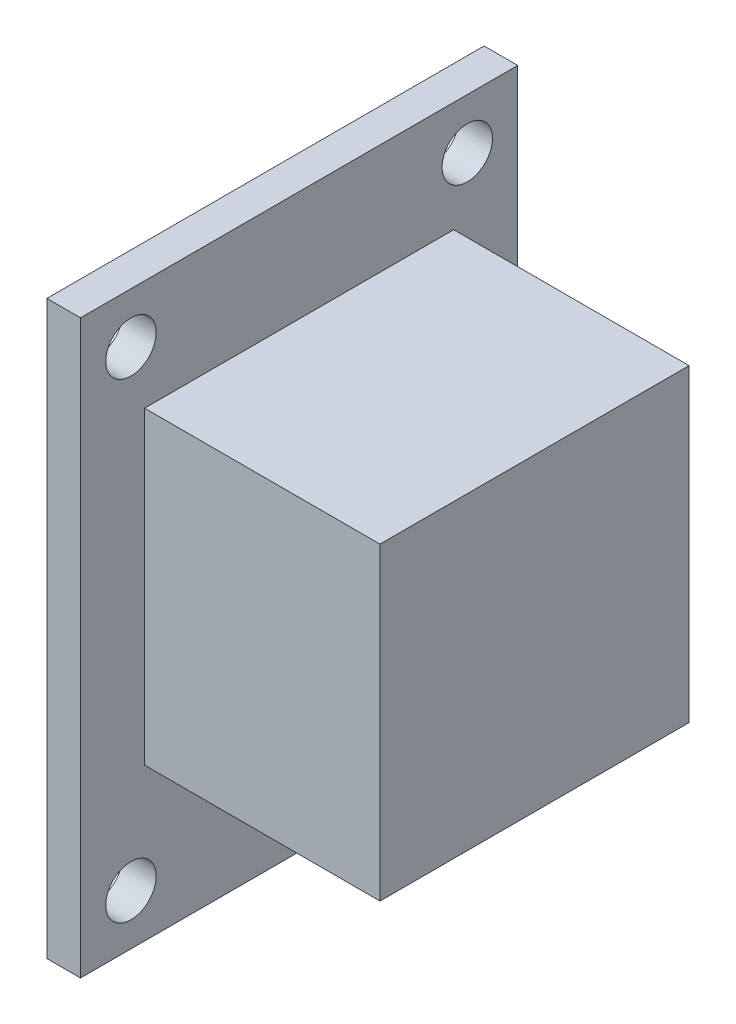
ISO-10303-21;
HEADER;
FILE_DESCRIPTION(('STEP AP214'),'2;1');
FILE_NAME('part.step','',(''),(''),'','','');
FILE_SCHEMA(('AUTOMOTIVE_DESIGN { 1 0 10303 214 1 1 1 1 }'));
ENDSEC;
DATA;
#1=APPLICATION_CONTEXT('core data for automotive mechanical design processes');
#2=APPLICATION_PROTOCOL_DEFINITION('international standard','automotive_design',2000,#1);
#3=PRODUCT_CONTEXT('',#1,'mechanical');
#4=PRODUCT('Part','Part','',(#3));
#5=PRODUCT_RELATED_PRODUCT_CATEGORY('part','',(#4));
#6=PRODUCT_DEFINITION_FORMATION('','',#4);
#7=PRODUCT_DEFINITION_CONTEXT('part definition',#1,'design');
#8=PRODUCT_DEFINITION('design','',#6,#7);
#9=PRODUCT_DEFINITION_SHAPE('','',#8);
#10=(LENGTH_UNIT() NAMED_UNIT(*) SI_UNIT(.MILLI.,.METRE.));
#11=(NAMED_UNIT(*) PLANE_ANGLE_UNIT() SI_UNIT($,.RADIAN.));
#12=(NAMED_UNIT(*) SI_UNIT($,.STERADIAN.) SOLID_ANGLE_UNIT());
#13=UNCERTAINTY_MEASURE_WITH_UNIT(LENGTH_MEASURE(1.E-05),#10,'distance_accuracy_value','');
#14=(GEOMETRIC_REPRESENTATION_CONTEXT(3) GLOBAL_UNCERTAINTY_ASSIGNED_CONTEXT((#13)) GLOBAL_UNIT_ASSIGNED_CONTEXT((#10,
#11,#12)) REPRESENTATION_CONTEXT('',''));
#15=CARTESIAN_POINT('',(0.,0.,0.));
#16=DIRECTION('',(0.,0.,1.));
#17=DIRECTION('',(1.,0.,0.));
#18=AXIS2_PLACEMENT_3D('',#15,#16,#17);
#19=CARTESIAN_POINT('',(14.,-7.94238815542512,-9.19238815542511));
#20=DIRECTION('',(0.,0.,1.));
#21=DIRECTION('',(1.,0.,0.));
#22=AXIS2_PLACEMENT_3D('',#19,#20,#21);
#23=PLANE('',#22);
#24=DIRECTION('',(0.,1.,0.));
#25=VECTOR('',#24,1.);
#26=CARTESIAN_POINT('',(0.,-7.94238815542512,-9.19238815542511));
#27=LINE('',#26,#25);
#28=CARTESIAN_POINT('',(0.,-7.94238815542512,-9.19238815542511));
#29=VERTEX_POINT('',#28);
#30=CARTESIAN_POINT('',(0.,10.4423881554251,-9.19238815542511));
#31=VERTEX_POINT('',#30);
#32=EDGE_CURVE('E128',#29,#31,#27,.T.);
#33=ORIENTED_EDGE('',*,*,#32,.T.);
#34=DIRECTION('',(-1.,0.,0.));
#35=VECTOR('',#34,1.);
#36=CARTESIAN_POINT('',(14.,10.4423881554251,-9.19238815542511));
#37=LINE('',#36,#35);
#38=CARTESIAN_POINT('',(14.,10.4423881554251,-9.19238815542511));
#39=VERTEX_POINT('',#38);
#40=EDGE_CURVE('E11',#39,#31,#37,.T.);
#41=ORIENTED_EDGE('',*,*,#40,.F.);
#42=DIRECTION('',(0.,1.,0.));
#43=VECTOR('',#42,1.);
#44=CARTESIAN_POINT('',(14.,-7.94238815542512,-9.19238815542511));
#45=LINE('',#44,#43);
#46=CARTESIAN_POINT('',(14.,-7.94238815542512,-9.19238815542511));
#47=VERTEX_POINT('',#46);
#48=EDGE_CURVE('E137',#47,#39,#45,.T.);
#49=ORIENTED_EDGE('',*,*,#48,.F.);
#50=DIRECTION('',(-1.,0.,0.));
#51=VECTOR('',#50,1.);
#52=CARTESIAN_POINT('',(14.,-7.94238815542512,-9.19238815542511));
#53=LINE('',#52,#51);
#54=EDGE_CURVE('E144',#47,#29,#53,.T.);
#55=ORIENTED_EDGE('',*,*,#54,.T.);
#56=EDGE_LOOP('',(#33,#41,#49,#55));
#57=FACE_BOUND('',#56,.T.);
#58=ADVANCED_FACE('F43',(#57),#23,.F.);
#59=CARTESIAN_POINT('',(14.,10.4423881554251,9.19238815542512));
#60=DIRECTION('',(0.,-1.,0.));
#61=DIRECTION('',(0.,0.,-1.));
#62=AXIS2_PLACEMENT_3D('',#59,#60,#61);
#63=PLANE('',#62);
#64=DIRECTION('',(0.,0.,1.));
#65=VECTOR('',#64,1.);
#66=CARTESIAN_POINT('',(0.,10.4423881554251,9.19238815542512));
#67=LINE('',#66,#65);
#68=CARTESIAN_POINT('',(0.,10.4423881554251,9.19238815542512));
#69=VERTEX_POINT('',#68);
#70=EDGE_CURVE('E131',#31,#69,#67,.T.);
#71=ORIENTED_EDGE('',*,*,#70,.T.);
#72=DIRECTION('',(-1.,0.,0.));
#73=VECTOR('',#72,1.);
#74=CARTESIAN_POINT('',(14.,10.4423881554251,9.19238815542512));
#75=LINE('',#74,#73);
#76=CARTESIAN_POINT('',(14.,10.4423881554251,9.19238815542512));
#77=VERTEX_POINT('',#76);
#78=EDGE_CURVE('E51',#77,#69,#75,.T.);
#79=ORIENTED_EDGE('',*,*,#78,.F.);
#80=DIRECTION('',(0.,0.,1.));
#81=VECTOR('',#80,1.);
#82=CARTESIAN_POINT('',(14.,10.4423881554251,9.19238815542512));
#83=LINE('',#82,#81);
#84=EDGE_CURVE('E139',#39,#77,#83,.T.);
#85=ORIENTED_EDGE('',*,*,#84,.F.);
#86=ORIENTED_EDGE('',*,*,#40,.T.);
#87=EDGE_LOOP('',(#71,#79,#85,#86));
#88=FACE_BOUND('',#87,.T.);
#89=ADVANCED_FACE('F165',(#88),#63,.F.);
#90=CARTESIAN_POINT('',(14.,-7.94238815542512,9.19238815542512));
#91=DIRECTION('',(0.,0.,-1.));
#92=DIRECTION('',(-1.,0.,0.));
#93=AXIS2_PLACEMENT_3D('',#90,#91,#92);
#94=PLANE('',#93);
#95=DIRECTION('',(0.,-1.,0.));
#96=VECTOR('',#95,1.);
#97=CARTESIAN_POINT('',(0.,-7.94238815542512,9.19238815542512));
#98=LINE('',#97,#96);
#99=CARTESIAN_POINT('',(0.,-7.94238815542512,9.19238815542512));
#100=VERTEX_POINT('',#99);
#101=EDGE_CURVE('E148',#69,#100,#98,.T.);
#102=ORIENTED_EDGE('',*,*,#101,.T.);
#103=DIRECTION('',(-1.,0.,0.));
#104=VECTOR('',#103,1.);
#105=CARTESIAN_POINT('',(14.,-7.94238815542512,9.19238815542512));
#106=LINE('',#105,#104);
#107=CARTESIAN_POINT('',(14.,-7.94238815542512,9.19238815542512));
#108=VERTEX_POINT('',#107);
#109=EDGE_CURVE('E155',#108,#100,#106,.T.);
#110=ORIENTED_EDGE('',*,*,#109,.F.);
#111=DIRECTION('',(0.,-1.,0.));
#112=VECTOR('',#111,1.);
#113=CARTESIAN_POINT('',(14.,-7.94238815542512,9.19238815542512));
#114=LINE('',#113,#112);
#115=EDGE_CURVE('E142',#77,#108,#114,.T.);
#116=ORIENTED_EDGE('',*,*,#115,.F.);
#117=ORIENTED_EDGE('',*,*,#78,.T.);
#118=EDGE_LOOP('',(#102,#110,#116,#117));
#119=FACE_BOUND('',#118,.T.);
#120=ADVANCED_FACE('F161',(#119),#94,.F.);
#121=CARTESIAN_POINT('',(14.,-7.94238815542512,9.19238815542512));
#122=DIRECTION('',(0.,1.,0.));
#123=DIRECTION('',(0.,0.,1.));
#124=AXIS2_PLACEMENT_3D('',#121,#122,#123);
#125=PLANE('',#124);
#126=DIRECTION('',(0.,0.,-1.));
#127=VECTOR('',#126,1.);
#128=CARTESIAN_POINT('',(0.,-7.94238815542512,9.19238815542512));
#129=LINE('',#128,#127);
#130=EDGE_CURVE('E140',#100,#29,#129,.T.);
#131=ORIENTED_EDGE('',*,*,#130,.T.);
#132=ORIENTED_EDGE('',*,*,#54,.F.);
#133=DIRECTION('',(0.,0.,-1.));
#134=VECTOR('',#133,1.);
#135=CARTESIAN_POINT('',(14.,-7.94238815542512,9.19238815542512));
#136=LINE('',#135,#134);
#137=EDGE_CURVE('E58',#108,#47,#136,.T.);
#138=ORIENTED_EDGE('',*,*,#137,.F.);
#139=ORIENTED_EDGE('',*,*,#109,.T.);
#140=EDGE_LOOP('',(#131,#132,#138,#139));
#141=FACE_BOUND('',#140,.T.);
#142=ADVANCED_FACE('F170',(#141),#125,.F.);
#143=CARTESIAN_POINT('',(14.,0.,0.));
#144=DIRECTION('',(-1.,0.,0.));
#145=DIRECTION('',(0.,0.,1.));
#146=AXIS2_PLACEMENT_3D('',#143,#144,#145);
#147=PLANE('',#146);
#148=ORIENTED_EDGE('',*,*,#48,.T.);
#149=ORIENTED_EDGE('',*,*,#84,.T.);
#150=ORIENTED_EDGE('',*,*,#115,.T.);
#151=ORIENTED_EDGE('',*,*,#137,.T.);
#152=EDGE_LOOP('',(#148,#149,#150,#151));
#153=FACE_BOUND('',#152,.T.);
#154=ADVANCED_FACE('F173',(#153),#147,.F.);
#155=CARTESIAN_POINT('',(0.,0.,0.));
#156=DIRECTION('',(1.,0.,0.));
#157=DIRECTION('',(0.,0.,-1.));
#158=AXIS2_PLACEMENT_3D('',#155,#156,#157);
#159=PLANE('',#158);
#160=CARTESIAN_POINT('',(0.,14.,-10.));
#161=DIRECTION('',(1.,0.,0.));
#162=DIRECTION('',(0.,0.,-1.));
#163=AXIS2_PLACEMENT_3D('',#160,#161,#162);
#164=CIRCLE('',#163,1.5);
#165=CARTESIAN_POINT('',(0.,14.,-11.5));
#166=VERTEX_POINT('',#165);
#167=EDGE_CURVE('E342',#166,#166,#164,.T.);
#168=ORIENTED_EDGE('',*,*,#167,.F.);
#169=EDGE_LOOP('',(#168));
#170=FACE_BOUND('',#169,.T.);
#171=CARTESIAN_POINT('',(0.,-14.,10.));
#172=DIRECTION('',(1.,0.,0.));
#173=DIRECTION('',(0.,0.,-1.));
#174=AXIS2_PLACEMENT_3D('',#171,#172,#173);
#175=CIRCLE('',#174,1.5);
#176=CARTESIAN_POINT('',(0.,-14.,8.49999999999999));
#177=VERTEX_POINT('',#176);
#178=EDGE_CURVE('E348',#177,#177,#175,.T.);
#179=ORIENTED_EDGE('',*,*,#178,.F.);
#180=EDGE_LOOP('',(#179));
#181=FACE_BOUND('',#180,.T.);
#182=CARTESIAN_POINT('',(0.,-14.,-10.));
#183=DIRECTION('',(1.,0.,0.));
#184=DIRECTION('',(0.,0.,-1.));
#185=AXIS2_PLACEMENT_3D('',#182,#183,#184);
#186=CIRCLE('',#185,1.5);
#187=CARTESIAN_POINT('',(0.,-14.,-11.5));
#188=VERTEX_POINT('',#187);
#189=EDGE_CURVE('E359',#188,#188,#186,.T.);
#190=ORIENTED_EDGE('',*,*,#189,.F.);
#191=EDGE_LOOP('',(#190));
#192=FACE_BOUND('',#191,.T.);
#193=CARTESIAN_POINT('',(0.,14.,10.));
#194=DIRECTION('',(1.,0.,0.));
#195=DIRECTION('',(0.,0.,-1.));
#196=AXIS2_PLACEMENT_3D('',#193,#194,#195);
#197=CIRCLE('',#196,1.5);
#198=CARTESIAN_POINT('',(0.,14.,8.5));
#199=VERTEX_POINT('',#198);
#200=EDGE_CURVE('E343',#199,#199,#197,.T.);
#201=ORIENTED_EDGE('',*,*,#200,.F.);
#202=EDGE_LOOP('',(#201));
#203=FACE_BOUND('',#202,.T.);
#204=DIRECTION('',(0.,1.,0.));
#205=VECTOR('',#204,1.);
#206=CARTESIAN_POINT('',(0.,-17.,13.));
#207=LINE('',#206,#205);
#208=CARTESIAN_POINT('',(0.,-17.,13.));
#209=VERTEX_POINT('',#208);
#210=CARTESIAN_POINT('',(0.,17.,13.));
#211=VERTEX_POINT('',#210);
#212=EDGE_CURVE('E127',#209,#211,#207,.T.);
#213=ORIENTED_EDGE('',*,*,#212,.F.);
#214=DIRECTION('',(0.,0.,1.));
#215=VECTOR('',#214,1.);
#216=CARTESIAN_POINT('',(0.,-17.,-13.));
#217=LINE('',#216,#215);
#218=CARTESIAN_POINT('',(0.,-17.,-13.));
#219=VERTEX_POINT('',#218);
#220=EDGE_CURVE('E123',#219,#209,#217,.T.);
#221=ORIENTED_EDGE('',*,*,#220,.F.);
#222=DIRECTION('',(0.,-1.,0.));
#223=VECTOR('',#222,1.);
#224=CARTESIAN_POINT('',(0.,-17.,-13.));
#225=LINE('',#224,#223);
#226=CARTESIAN_POINT('',(0.,17.,-13.));
#227=VERTEX_POINT('',#226);
#228=EDGE_CURVE('E368',#227,#219,#225,.T.);
#229=ORIENTED_EDGE('',*,*,#228,.F.);
#230=DIRECTION('',(0.,0.,-1.));
#231=VECTOR('',#230,1.);
#232=CARTESIAN_POINT('',(0.,17.,-13.));
#233=LINE('',#232,#231);
#234=EDGE_CURVE('E366',#211,#227,#233,.T.);
#235=ORIENTED_EDGE('',*,*,#234,.F.);
#236=EDGE_LOOP('',(#213,#221,#229,#235));
#237=FACE_BOUND('',#236,.T.);
#238=ORIENTED_EDGE('',*,*,#32,.F.);
#239=ORIENTED_EDGE('',*,*,#130,.F.);
#240=ORIENTED_EDGE('',*,*,#101,.F.);
#241=ORIENTED_EDGE('',*,*,#70,.F.);
#242=EDGE_LOOP('',(#238,#239,#240,#241));
#243=FACE_BOUND('',#242,.T.);
#244=ADVANCED_FACE('F168',(#170,#181,#192,#203,#237,#243),#159,.T.);
#245=CARTESIAN_POINT('',(-2.,-17.,13.));
#246=DIRECTION('',(0.,0.,-1.));
#247=DIRECTION('',(-1.,0.,0.));
#248=AXIS2_PLACEMENT_3D('',#245,#246,#247);
#249=PLANE('',#248);
#250=ORIENTED_EDGE('',*,*,#212,.T.);
#251=DIRECTION('',(1.,0.,0.));
#252=VECTOR('',#251,1.);
#253=CARTESIAN_POINT('',(-2.,17.,13.));
#254=LINE('',#253,#252);
#255=CARTESIAN_POINT('',(-2.,17.,13.));
#256=VERTEX_POINT('',#255);
#257=EDGE_CURVE('E107',#256,#211,#254,.T.);
#258=ORIENTED_EDGE('',*,*,#257,.F.);
#259=DIRECTION('',(0.,1.,0.));
#260=VECTOR('',#259,1.);
#261=CARTESIAN_POINT('',(-2.,-17.,13.));
#262=LINE('',#261,#260);
#263=CARTESIAN_POINT('',(-2.,-17.,13.));
#264=VERTEX_POINT('',#263);
#265=EDGE_CURVE('E114',#264,#256,#262,.T.);
#266=ORIENTED_EDGE('',*,*,#265,.F.);
#267=DIRECTION('',(1.,0.,0.));
#268=VECTOR('',#267,1.);
#269=CARTESIAN_POINT('',(-2.,-17.,13.));
#270=LINE('',#269,#268);
#271=EDGE_CURVE('E364',#264,#209,#270,.T.);
#272=ORIENTED_EDGE('',*,*,#271,.T.);
#273=EDGE_LOOP('',(#250,#258,#266,#272));
#274=FACE_BOUND('',#273,.T.);
#275=ADVANCED_FACE('F125',(#274),#249,.F.);
#276=CARTESIAN_POINT('',(-2.,17.,-13.));
#277=DIRECTION('',(0.,-1.,0.));
#278=DIRECTION('',(0.,0.,-1.));
#279=AXIS2_PLACEMENT_3D('',#276,#277,#278);
#280=PLANE('',#279);
#281=ORIENTED_EDGE('',*,*,#234,.T.);
#282=DIRECTION('',(1.,0.,0.));
#283=VECTOR('',#282,1.);
#284=CARTESIAN_POINT('',(-2.,17.,-13.));
#285=LINE('',#284,#283);
#286=CARTESIAN_POINT('',(-2.,17.,-13.));
#287=VERTEX_POINT('',#286);
#288=EDGE_CURVE('E110',#287,#227,#285,.T.);
#289=ORIENTED_EDGE('',*,*,#288,.F.);
#290=DIRECTION('',(0.,0.,-1.));
#291=VECTOR('',#290,1.);
#292=CARTESIAN_POINT('',(-2.,17.,-13.));
#293=LINE('',#292,#291);
#294=EDGE_CURVE('E103',#256,#287,#293,.T.);
#295=ORIENTED_EDGE('',*,*,#294,.F.);
#296=ORIENTED_EDGE('',*,*,#257,.T.);
#297=EDGE_LOOP('',(#281,#289,#295,#296));
#298=FACE_BOUND('',#297,.T.);
#299=ADVANCED_FACE('F105',(#298),#280,.F.);
#300=CARTESIAN_POINT('',(-2.,-17.,-13.));
#301=DIRECTION('',(0.,0.,1.));
#302=DIRECTION('',(1.,0.,0.));
#303=AXIS2_PLACEMENT_3D('',#300,#301,#302);
#304=PLANE('',#303);
#305=ORIENTED_EDGE('',*,*,#228,.T.);
#306=DIRECTION('',(1.,0.,0.));
#307=VECTOR('',#306,1.);
#308=CARTESIAN_POINT('',(-2.,-17.,-13.));
#309=LINE('',#308,#307);
#310=CARTESIAN_POINT('',(-2.,-17.,-13.));
#311=VERTEX_POINT('',#310);
#312=EDGE_CURVE('E133',#311,#219,#309,.T.);
#313=ORIENTED_EDGE('',*,*,#312,.F.);
#314=DIRECTION('',(0.,-1.,0.));
#315=VECTOR('',#314,1.);
#316=CARTESIAN_POINT('',(-2.,-17.,-13.));
#317=LINE('',#316,#315);
#318=EDGE_CURVE('E113',#287,#311,#317,.T.);
#319=ORIENTED_EDGE('',*,*,#318,.F.);
#320=ORIENTED_EDGE('',*,*,#288,.T.);
#321=EDGE_LOOP('',(#305,#313,#319,#320));
#322=FACE_BOUND('',#321,.T.);
#323=ADVANCED_FACE('F218',(#322),#304,.F.);
#324=CARTESIAN_POINT('',(-2.,-17.,-13.));
#325=DIRECTION('',(0.,1.,0.));
#326=DIRECTION('',(0.,0.,1.));
#327=AXIS2_PLACEMENT_3D('',#324,#325,#326);
#328=PLANE('',#327);
#329=ORIENTED_EDGE('',*,*,#220,.T.);
#330=ORIENTED_EDGE('',*,*,#271,.F.);
#331=DIRECTION('',(0.,0.,1.));
#332=VECTOR('',#331,1.);
#333=CARTESIAN_POINT('',(-2.,-17.,-13.));
#334=LINE('',#333,#332);
#335=EDGE_CURVE('E119',#311,#264,#334,.T.);
#336=ORIENTED_EDGE('',*,*,#335,.F.);
#337=ORIENTED_EDGE('',*,*,#312,.T.);
#338=EDGE_LOOP('',(#329,#330,#336,#337));
#339=FACE_BOUND('',#338,.T.);
#340=ADVANCED_FACE('F228',(#339),#328,.F.);
#341=CARTESIAN_POINT('',(-2.,0.,0.));
#342=DIRECTION('',(1.,0.,0.));
#343=DIRECTION('',(0.,0.,-1.));
#344=AXIS2_PLACEMENT_3D('',#341,#342,#343);
#345=PLANE('',#344);
#346=CARTESIAN_POINT('',(-2.,14.,-10.));
#347=DIRECTION('',(1.,0.,0.));
#348=DIRECTION('',(0.,0.,-1.));
#349=AXIS2_PLACEMENT_3D('',#346,#347,#348);
#350=CIRCLE('',#349,1.5);
#351=CARTESIAN_POINT('',(-2.,14.,-11.5));
#352=VERTEX_POINT('',#351);
#353=EDGE_CURVE('E339',#352,#352,#350,.T.);
#354=ORIENTED_EDGE('',*,*,#353,.T.);
#355=EDGE_LOOP('',(#354));
#356=FACE_BOUND('',#355,.T.);
#357=CARTESIAN_POINT('',(-2.,-14.,10.));
#358=DIRECTION('',(1.,0.,0.));
#359=DIRECTION('',(0.,0.,-1.));
#360=AXIS2_PLACEMENT_3D('',#357,#358,#359);
#361=CIRCLE('',#360,1.5);
#362=CARTESIAN_POINT('',(-2.,-14.,8.49999999999999));
#363=VERTEX_POINT('',#362);
#364=EDGE_CURVE('E356',#363,#363,#361,.T.);
#365=ORIENTED_EDGE('',*,*,#364,.T.);
#366=EDGE_LOOP('',(#365));
#367=FACE_BOUND('',#366,.T.);
#368=CARTESIAN_POINT('',(-2.,-14.,-10.));
#369=DIRECTION('',(1.,0.,0.));
#370=DIRECTION('',(0.,0.,-1.));
#371=AXIS2_PLACEMENT_3D('',#368,#369,#370);
#372=CIRCLE('',#371,1.5);
#373=CARTESIAN_POINT('',(-2.,-14.,-11.5));
#374=VERTEX_POINT('',#373);
#375=EDGE_CURVE('E351',#374,#374,#372,.T.);
#376=ORIENTED_EDGE('',*,*,#375,.T.);
#377=EDGE_LOOP('',(#376));
#378=FACE_BOUND('',#377,.T.);
#379=CARTESIAN_POINT('',(-2.,14.,10.));
#380=DIRECTION('',(1.,0.,0.));
#381=DIRECTION('',(0.,0.,-1.));
#382=AXIS2_PLACEMENT_3D('',#379,#380,#381);
#383=CIRCLE('',#382,1.5);
#384=CARTESIAN_POINT('',(-2.,14.,8.5));
#385=VERTEX_POINT('',#384);
#386=EDGE_CURVE('E346',#385,#385,#383,.T.);
#387=ORIENTED_EDGE('',*,*,#386,.T.);
#388=EDGE_LOOP('',(#387));
#389=FACE_BOUND('',#388,.T.);
#390=ORIENTED_EDGE('',*,*,#265,.T.);
#391=ORIENTED_EDGE('',*,*,#294,.T.);
#392=ORIENTED_EDGE('',*,*,#318,.T.);
#393=ORIENTED_EDGE('',*,*,#335,.T.);
#394=EDGE_LOOP('',(#390,#391,#392,#393));
#395=FACE_BOUND('',#394,.T.);
#396=ADVANCED_FACE('F117',(#356,#367,#378,#389,#395),#345,.F.);
#397=CARTESIAN_POINT('',(-2.,14.,10.));
#398=DIRECTION('',(1.,0.,0.));
#399=DIRECTION('',(0.,0.,-1.));
#400=AXIS2_PLACEMENT_3D('',#397,#398,#399);
#401=CYLINDRICAL_SURFACE('',#400,1.5);
#402=ORIENTED_EDGE('',*,*,#386,.F.);
#403=EDGE_LOOP('',(#402));
#404=FACE_BOUND('',#403,.T.);
#405=ORIENTED_EDGE('',*,*,#200,.T.);
#406=EDGE_LOOP('',(#405));
#407=FACE_BOUND('',#406,.T.);
#408=ADVANCED_FACE('F255',(#404,#407),#401,.F.);
#409=CARTESIAN_POINT('',(-2.,-14.,-10.));
#410=DIRECTION('',(1.,0.,0.));
#411=DIRECTION('',(0.,0.,-1.));
#412=AXIS2_PLACEMENT_3D('',#409,#410,#411);
#413=CYLINDRICAL_SURFACE('',#412,1.5);
#414=ORIENTED_EDGE('',*,*,#375,.F.);
#415=EDGE_LOOP('',(#414));
#416=FACE_BOUND('',#415,.T.);
#417=ORIENTED_EDGE('',*,*,#189,.T.);
#418=EDGE_LOOP('',(#417));
#419=FACE_BOUND('',#418,.T.);
#420=ADVANCED_FACE('F266',(#416,#419),#413,.F.);
#421=CARTESIAN_POINT('',(-2.,-14.,10.));
#422=DIRECTION('',(1.,0.,0.));
#423=DIRECTION('',(0.,0.,-1.));
#424=AXIS2_PLACEMENT_3D('',#421,#422,#423);
#425=CYLINDRICAL_SURFACE('',#424,1.5);
#426=ORIENTED_EDGE('',*,*,#364,.F.);
#427=EDGE_LOOP('',(#426));
#428=FACE_BOUND('',#427,.T.);
#429=ORIENTED_EDGE('',*,*,#178,.T.);
#430=EDGE_LOOP('',(#429));
#431=FACE_BOUND('',#430,.T.);
#432=ADVANCED_FACE('F277',(#428,#431),#425,.F.);
#433=CARTESIAN_POINT('',(-2.,14.,-10.));
#434=DIRECTION('',(1.,0.,0.));
#435=DIRECTION('',(0.,0.,-1.));
#436=AXIS2_PLACEMENT_3D('',#433,#434,#435);
#437=CYLINDRICAL_SURFACE('',#436,1.5);
#438=ORIENTED_EDGE('',*,*,#353,.F.);
#439=EDGE_LOOP('',(#438));
#440=FACE_BOUND('',#439,.T.);
#441=ORIENTED_EDGE('',*,*,#167,.T.);
#442=EDGE_LOOP('',(#441));
#443=FACE_BOUND('',#442,.T.);
#444=ADVANCED_FACE('F288',(#440,#443),#437,.F.);
#445=CLOSED_SHELL('',(#58,#89,#120,#142,#154,#244,#275,#299,#323,#340,#396,#408,#420,#432,#444));
#446=MANIFOLD_SOLID_BREP('B2',#445);
#447=ADVANCED_BREP_SHAPE_REPRESENTATION('',(#18,#446),#14);
#448=SHAPE_DEFINITION_REPRESENTATION(#9,#447);
ENDSEC;
END-ISO-10303-21;
